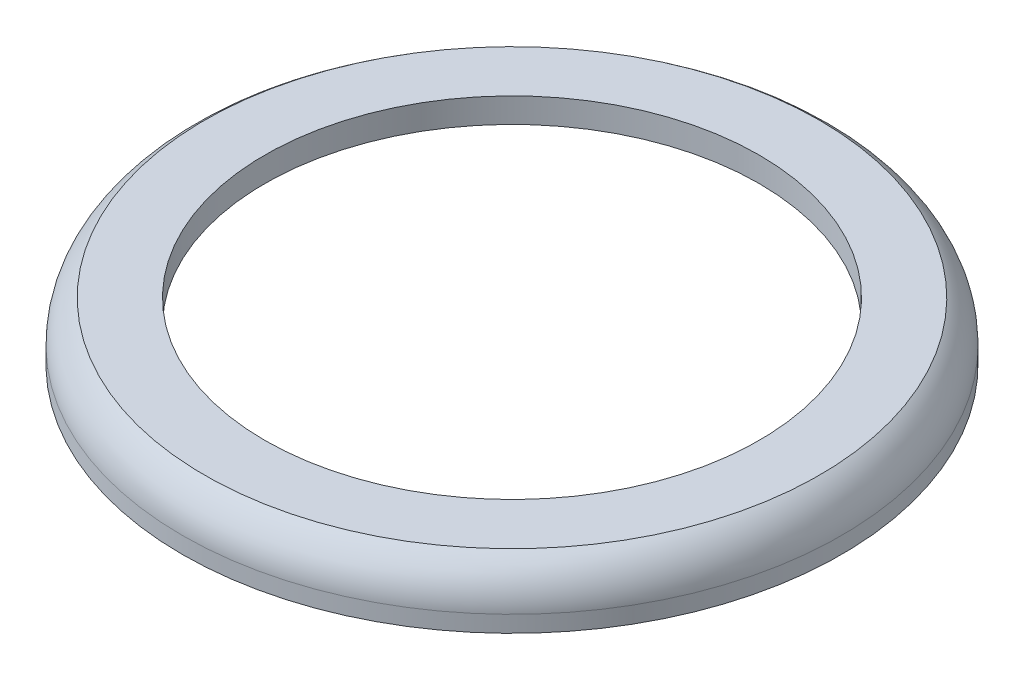
ISO-10303-21;
HEADER;
FILE_DESCRIPTION(('STEP AP214'),'2;1');
FILE_NAME('part.step','',(''),(''),'','','');
FILE_SCHEMA(('AUTOMOTIVE_DESIGN { 1 0 10303 214 1 1 1 1 }'));
ENDSEC;
DATA;
#1=APPLICATION_CONTEXT('core data for automotive mechanical design processes');
#2=APPLICATION_PROTOCOL_DEFINITION('international standard','automotive_design',2000,#1);
#3=PRODUCT_CONTEXT('',#1,'mechanical');
#4=PRODUCT('Part','Part','',(#3));
#5=PRODUCT_RELATED_PRODUCT_CATEGORY('part','',(#4));
#6=PRODUCT_DEFINITION_FORMATION('','',#4);
#7=PRODUCT_DEFINITION_CONTEXT('part definition',#1,'design');
#8=PRODUCT_DEFINITION('design','',#6,#7);
#9=PRODUCT_DEFINITION_SHAPE('','',#8);
#10=(LENGTH_UNIT() NAMED_UNIT(*) SI_UNIT(.MILLI.,.METRE.));
#11=(NAMED_UNIT(*) PLANE_ANGLE_UNIT() SI_UNIT($,.RADIAN.));
#12=(NAMED_UNIT(*) SI_UNIT($,.STERADIAN.) SOLID_ANGLE_UNIT());
#13=UNCERTAINTY_MEASURE_WITH_UNIT(LENGTH_MEASURE(1.E-05),#10,'distance_accuracy_value','');
#14=(GEOMETRIC_REPRESENTATION_CONTEXT(3) GLOBAL_UNCERTAINTY_ASSIGNED_CONTEXT((#13)) GLOBAL_UNIT_ASSIGNED_CONTEXT((#10,
#11,#12)) REPRESENTATION_CONTEXT('',''));
#15=CARTESIAN_POINT('',(0.,0.,0.));
#16=DIRECTION('',(0.,0.,1.));
#17=DIRECTION('',(1.,0.,0.));
#18=AXIS2_PLACEMENT_3D('',#15,#16,#17);
#19=CARTESIAN_POINT('',(18.5,0.,0.));
#20=DIRECTION('',(0.,-1.,0.));
#21=DIRECTION('',(0.,0.,-1.));
#22=AXIS2_PLACEMENT_3D('',#19,#20,#21);
#23=PLANE('',#22);
#24=CARTESIAN_POINT('',(0.,0.,0.));
#25=DIRECTION('',(0.,-1.,0.));
#26=DIRECTION('',(0.,0.,-1.));
#27=AXIS2_PLACEMENT_3D('',#24,#25,#26);
#28=CIRCLE('',#27,18.75);
#29=CARTESIAN_POINT('',(0.,0.,-18.75));
#30=VERTEX_POINT('',#29);
#31=EDGE_CURVE('E40',#30,#30,#28,.F.);
#32=ORIENTED_EDGE('',*,*,#31,.T.);
#33=EDGE_LOOP('',(#32));
#34=FACE_BOUND('',#33,.T.);
#35=CARTESIAN_POINT('',(0.,0.,0.));
#36=DIRECTION('',(0.,-1.,0.));
#37=DIRECTION('',(0.,0.,-1.));
#38=AXIS2_PLACEMENT_3D('',#35,#36,#37);
#39=CIRCLE('',#38,20.);
#40=CARTESIAN_POINT('',(0.,0.,-20.));
#41=VERTEX_POINT('',#40);
#42=EDGE_CURVE('E58',#41,#41,#39,.T.);
#43=ORIENTED_EDGE('',*,*,#42,.T.);
#44=EDGE_LOOP('',(#43));
#45=FACE_BOUND('',#44,.T.);
#46=ADVANCED_FACE('F32',(#34,#45),#23,.T.);
#47=CARTESIAN_POINT('',(0.,0.,0.));
#48=DIRECTION('',(0.,-1.,0.));
#49=DIRECTION('',(0.,0.,-1.));
#50=AXIS2_PLACEMENT_3D('',#47,#48,#49);
#51=CYLINDRICAL_SURFACE('',#50,20.);
#52=CARTESIAN_POINT('',(0.,1.,0.));
#53=DIRECTION('',(0.,-1.,0.));
#54=DIRECTION('',(0.,0.,-1.));
#55=AXIS2_PLACEMENT_3D('',#52,#53,#54);
#56=CIRCLE('',#55,20.);
#57=CARTESIAN_POINT('',(0.,1.,-20.));
#58=VERTEX_POINT('',#57);
#59=EDGE_CURVE('E61',#58,#58,#56,.T.);
#60=ORIENTED_EDGE('',*,*,#59,.T.);
#61=EDGE_LOOP('',(#60));
#62=FACE_BOUND('',#61,.T.);
#63=ORIENTED_EDGE('',*,*,#42,.F.);
#64=EDGE_LOOP('',(#63));
#65=FACE_BOUND('',#64,.T.);
#66=ADVANCED_FACE('F96',(#62,#65),#51,.T.);
#67=CARTESIAN_POINT('',(0.,1.,0.));
#68=DIRECTION('',(0.,-1.,0.));
#69=DIRECTION('',(0.,0.,-1.));
#70=AXIS2_PLACEMENT_3D('',#67,#68,#69);
#71=TOROIDAL_SURFACE('',#70,17.,3.);
#72=CARTESIAN_POINT('',(0.,3.5,0.));
#73=DIRECTION('',(0.,-1.,0.));
#74=DIRECTION('',(0.,0.,-1.));
#75=AXIS2_PLACEMENT_3D('',#72,#73,#74);
#76=CIRCLE('',#75,18.6583123951777);
#77=CARTESIAN_POINT('',(0.,3.5,-18.6583123951777));
#78=VERTEX_POINT('',#77);
#79=EDGE_CURVE('E64',#78,#78,#76,.T.);
#80=ORIENTED_EDGE('',*,*,#79,.T.);
#81=EDGE_LOOP('',(#80));
#82=FACE_BOUND('',#81,.T.);
#83=ORIENTED_EDGE('',*,*,#59,.F.);
#84=EDGE_LOOP('',(#83));
#85=FACE_BOUND('',#84,.T.);
#86=ADVANCED_FACE('F102',(#82,#85),#71,.T.);
#87=CARTESIAN_POINT('',(18.6583123951777,3.5,0.));
#88=DIRECTION('',(0.,1.,0.));
#89=DIRECTION('',(0.,0.,1.));
#90=AXIS2_PLACEMENT_3D('',#87,#88,#89);
#91=PLANE('',#90);
#92=CARTESIAN_POINT('',(0.,3.5,0.));
#93=DIRECTION('',(0.,-1.,0.));
#94=DIRECTION('',(0.,0.,-1.));
#95=AXIS2_PLACEMENT_3D('',#92,#93,#94);
#96=CIRCLE('',#95,15.);
#97=CARTESIAN_POINT('',(0.,3.5,-15.));
#98=VERTEX_POINT('',#97);
#99=EDGE_CURVE('E67',#98,#98,#96,.T.);
#100=ORIENTED_EDGE('',*,*,#99,.T.);
#101=EDGE_LOOP('',(#100));
#102=FACE_BOUND('',#101,.T.);
#103=ORIENTED_EDGE('',*,*,#79,.F.);
#104=EDGE_LOOP('',(#103));
#105=FACE_BOUND('',#104,.T.);
#106=ADVANCED_FACE('F109',(#102,#105),#91,.T.);
#107=CARTESIAN_POINT('',(0.,0.,0.));
#108=DIRECTION('',(0.,-1.,0.));
#109=DIRECTION('',(0.,0.,-1.));
#110=AXIS2_PLACEMENT_3D('',#107,#108,#109);
#111=CYLINDRICAL_SURFACE('',#110,15.);
#112=CARTESIAN_POINT('',(0.,2.,0.));
#113=DIRECTION('',(0.,-1.,0.));
#114=DIRECTION('',(0.,0.,-1.));
#115=AXIS2_PLACEMENT_3D('',#112,#113,#114);
#116=CIRCLE('',#115,15.);
#117=CARTESIAN_POINT('',(0.,2.,-15.));
#118=VERTEX_POINT('',#117);
#119=EDGE_CURVE('E70',#118,#118,#116,.T.);
#120=ORIENTED_EDGE('',*,*,#119,.T.);
#121=EDGE_LOOP('',(#120));
#122=FACE_BOUND('',#121,.T.);
#123=ORIENTED_EDGE('',*,*,#99,.F.);
#124=EDGE_LOOP('',(#123));
#125=FACE_BOUND('',#124,.T.);
#126=ADVANCED_FACE('F113',(#122,#125),#111,.F.);
#127=CARTESIAN_POINT('',(15.,2.,0.));
#128=DIRECTION('',(0.,-1.,0.));
#129=DIRECTION('',(0.,0.,-1.));
#130=AXIS2_PLACEMENT_3D('',#127,#128,#129);
#131=PLANE('',#130);
#132=CARTESIAN_POINT('',(0.,2.,0.));
#133=DIRECTION('',(0.,-1.,0.));
#134=DIRECTION('',(0.,0.,-1.));
#135=AXIS2_PLACEMENT_3D('',#132,#133,#134);
#136=CIRCLE('',#135,18.75);
#137=CARTESIAN_POINT('',(0.,2.,-18.75));
#138=VERTEX_POINT('',#137);
#139=EDGE_CURVE('E10',#138,#138,#136,.T.);
#140=ORIENTED_EDGE('',*,*,#139,.T.);
#141=EDGE_LOOP('',(#140));
#142=FACE_BOUND('',#141,.T.);
#143=ORIENTED_EDGE('',*,*,#119,.F.);
#144=EDGE_LOOP('',(#143));
#145=FACE_BOUND('',#144,.T.);
#146=ADVANCED_FACE('F117',(#142,#145),#131,.T.);
#147=CARTESIAN_POINT('',(0.,0.,0.));
#148=DIRECTION('',(0.,-1.,0.));
#149=DIRECTION('',(0.,0.,-1.));
#150=AXIS2_PLACEMENT_3D('',#147,#148,#149);
#151=CYLINDRICAL_SURFACE('',#150,19.);
#152=CARTESIAN_POINT('',(0.,1.25,0.));
#153=DIRECTION('',(0.,1.,0.));
#154=DIRECTION('',(0.,0.,1.));
#155=AXIS2_PLACEMENT_3D('',#152,#153,#154);
#156=CIRCLE('',#155,19.);
#157=CARTESIAN_POINT('',(0.,1.25,19.));
#158=VERTEX_POINT('',#157);
#159=EDGE_CURVE('E52',#158,#158,#156,.F.);
#160=ORIENTED_EDGE('',*,*,#159,.T.);
#161=EDGE_LOOP('',(#160));
#162=FACE_BOUND('',#161,.T.);
#163=CARTESIAN_POINT('',(0.,1.75,0.));
#164=DIRECTION('',(0.,-1.,0.));
#165=DIRECTION('',(0.,0.,-1.));
#166=AXIS2_PLACEMENT_3D('',#163,#164,#165);
#167=CIRCLE('',#166,19.);
#168=CARTESIAN_POINT('',(0.,1.75,-19.));
#169=VERTEX_POINT('',#168);
#170=EDGE_CURVE('E55',#169,#169,#167,.F.);
#171=ORIENTED_EDGE('',*,*,#170,.T.);
#172=EDGE_LOOP('',(#171));
#173=FACE_BOUND('',#172,.T.);
#174=ADVANCED_FACE('F91',(#162,#173),#151,.F.);
#175=CARTESIAN_POINT('',(0.,0.,0.));
#176=DIRECTION('',(0.,-1.,0.));
#177=DIRECTION('',(0.,0.,-1.));
#178=AXIS2_PLACEMENT_3D('',#175,#176,#177);
#179=CYLINDRICAL_SURFACE('',#178,18.5);
#180=CARTESIAN_POINT('',(0.,0.25,0.));
#181=DIRECTION('',(0.,-1.,0.));
#182=DIRECTION('',(0.,0.,-1.));
#183=AXIS2_PLACEMENT_3D('',#180,#181,#182);
#184=CIRCLE('',#183,18.5);
#185=CARTESIAN_POINT('',(0.,0.25,-18.5));
#186=VERTEX_POINT('',#185);
#187=EDGE_CURVE('E44',#186,#186,#184,.T.);
#188=ORIENTED_EDGE('',*,*,#187,.T.);
#189=EDGE_LOOP('',(#188));
#190=FACE_BOUND('',#189,.T.);
#191=CARTESIAN_POINT('',(0.,0.75,0.));
#192=DIRECTION('',(0.,1.,0.));
#193=DIRECTION('',(0.,0.,1.));
#194=AXIS2_PLACEMENT_3D('',#191,#192,#193);
#195=CIRCLE('',#194,18.5);
#196=CARTESIAN_POINT('',(0.,0.75,18.5));
#197=VERTEX_POINT('',#196);
#198=EDGE_CURVE('E49',#197,#197,#195,.T.);
#199=ORIENTED_EDGE('',*,*,#198,.T.);
#200=EDGE_LOOP('',(#199));
#201=FACE_BOUND('',#200,.T.);
#202=ADVANCED_FACE('F82',(#190,#201),#179,.F.);
#203=CARTESIAN_POINT('',(0.,0.75,0.));
#204=DIRECTION('',(0.,1.,0.));
#205=DIRECTION('',(0.,0.,1.));
#206=AXIS2_PLACEMENT_3D('',#203,#204,#205);
#207=TOROIDAL_SURFACE('',#206,18.75,0.25);
#208=ORIENTED_EDGE('',*,*,#198,.F.);
#209=EDGE_LOOP('',(#208));
#210=FACE_BOUND('',#209,.T.);
#211=CARTESIAN_POINT('',(0.,1.,0.));
#212=DIRECTION('',(0.,1.,0.));
#213=DIRECTION('',(0.,0.,1.));
#214=AXIS2_PLACEMENT_3D('',#211,#212,#213);
#215=CIRCLE('',#214,18.75);
#216=CARTESIAN_POINT('',(0.,1.,18.75));
#217=VERTEX_POINT('',#216);
#218=EDGE_CURVE('E36',#217,#217,#215,.F.);
#219=ORIENTED_EDGE('',*,*,#218,.F.);
#220=EDGE_LOOP('',(#219));
#221=FACE_BOUND('',#220,.T.);
#222=ADVANCED_FACE('F80',(#210,#221),#207,.T.);
#223=CARTESIAN_POINT('',(0.,1.25,0.));
#224=DIRECTION('',(0.,1.,0.));
#225=DIRECTION('',(0.,0.,1.));
#226=AXIS2_PLACEMENT_3D('',#223,#224,#225);
#227=TOROIDAL_SURFACE('',#226,18.75,0.25);
#228=ORIENTED_EDGE('',*,*,#218,.T.);
#229=EDGE_LOOP('',(#228));
#230=FACE_BOUND('',#229,.T.);
#231=ORIENTED_EDGE('',*,*,#159,.F.);
#232=EDGE_LOOP('',(#231));
#233=FACE_BOUND('',#232,.T.);
#234=ADVANCED_FACE('F77',(#230,#233),#227,.F.);
#235=CARTESIAN_POINT('',(0.,0.25,0.));
#236=DIRECTION('',(0.,-1.,0.));
#237=DIRECTION('',(0.,0.,-1.));
#238=AXIS2_PLACEMENT_3D('',#235,#236,#237);
#239=TOROIDAL_SURFACE('',#238,18.75,0.25);
#240=ORIENTED_EDGE('',*,*,#31,.F.);
#241=EDGE_LOOP('',(#240));
#242=FACE_BOUND('',#241,.T.);
#243=ORIENTED_EDGE('',*,*,#187,.F.);
#244=EDGE_LOOP('',(#243));
#245=FACE_BOUND('',#244,.T.);
#246=ADVANCED_FACE('F89',(#242,#245),#239,.T.);
#247=CARTESIAN_POINT('',(0.,1.75,0.));
#248=DIRECTION('',(0.,-1.,0.));
#249=DIRECTION('',(0.,0.,-1.));
#250=AXIS2_PLACEMENT_3D('',#247,#248,#249);
#251=TOROIDAL_SURFACE('',#250,18.75,0.25);
#252=ORIENTED_EDGE('',*,*,#170,.F.);
#253=EDGE_LOOP('',(#252));
#254=FACE_BOUND('',#253,.T.);
#255=ORIENTED_EDGE('',*,*,#139,.F.);
#256=EDGE_LOOP('',(#255));
#257=FACE_BOUND('',#256,.T.);
#258=ADVANCED_FACE('F34',(#254,#257),#251,.F.);
#259=CLOSED_SHELL('',(#46,#66,#86,#106,#126,#146,#174,#202,#222,#234,#246,#258));
#260=MANIFOLD_SOLID_BREP('B2',#259);
#261=ADVANCED_BREP_SHAPE_REPRESENTATION('',(#18,#260),#14);
#262=SHAPE_DEFINITION_REPRESENTATION(#9,#261);
ENDSEC;
END-ISO-10303-21;
